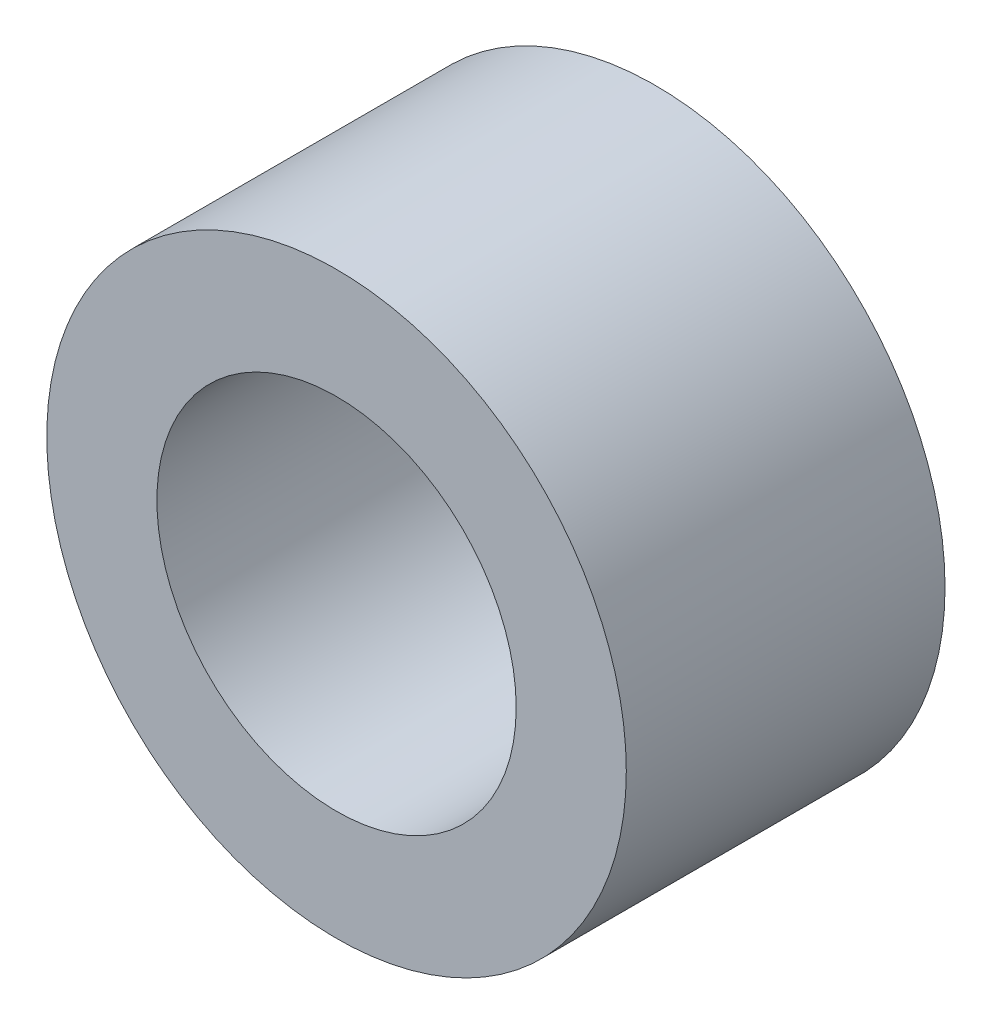
ISO-10303-21;
HEADER;
FILE_DESCRIPTION(('STEP AP214'),'2;1');
FILE_NAME('part.step','',(''),(''),'','','');
FILE_SCHEMA(('AUTOMOTIVE_DESIGN { 1 0 10303 214 1 1 1 1 }'));
ENDSEC;
DATA;
#1=APPLICATION_CONTEXT('core data for automotive mechanical design processes');
#2=APPLICATION_PROTOCOL_DEFINITION('international standard','automotive_design',2000,#1);
#3=PRODUCT_CONTEXT('',#1,'mechanical');
#4=PRODUCT('Part','Part','',(#3));
#5=PRODUCT_RELATED_PRODUCT_CATEGORY('part','',(#4));
#6=PRODUCT_DEFINITION_FORMATION('','',#4);
#7=PRODUCT_DEFINITION_CONTEXT('part definition',#1,'design');
#8=PRODUCT_DEFINITION('design','',#6,#7);
#9=PRODUCT_DEFINITION_SHAPE('','',#8);
#10=(LENGTH_UNIT() NAMED_UNIT(*) SI_UNIT(.MILLI.,.METRE.));
#11=(NAMED_UNIT(*) PLANE_ANGLE_UNIT() SI_UNIT($,.RADIAN.));
#12=(NAMED_UNIT(*) SI_UNIT($,.STERADIAN.) SOLID_ANGLE_UNIT());
#13=UNCERTAINTY_MEASURE_WITH_UNIT(LENGTH_MEASURE(1.E-05),#10,'distance_accuracy_value','');
#14=(GEOMETRIC_REPRESENTATION_CONTEXT(3) GLOBAL_UNCERTAINTY_ASSIGNED_CONTEXT((#13)) GLOBAL_UNIT_ASSIGNED_CONTEXT((#10,
#11,#12)) REPRESENTATION_CONTEXT('',''));
#15=CARTESIAN_POINT('',(0.,0.,0.));
#16=DIRECTION('',(0.,0.,1.));
#17=DIRECTION('',(1.,0.,0.));
#18=AXIS2_PLACEMENT_3D('',#15,#16,#17);
#19=CARTESIAN_POINT('',(0.,0.,5.5));
#20=DIRECTION('',(0.,0.,1.));
#21=DIRECTION('',(1.,0.,0.));
#22=AXIS2_PLACEMENT_3D('',#19,#20,#21);
#23=PLANE('',#22);
#24=CARTESIAN_POINT('',(0.,0.,5.5));
#25=DIRECTION('',(0.,0.,1.));
#26=DIRECTION('',(1.,0.,0.));
#27=AXIS2_PLACEMENT_3D('',#24,#25,#26);
#28=CIRCLE('',#27,5.);
#29=CARTESIAN_POINT('',(5.,0.,5.5));
#30=VERTEX_POINT('',#29);
#31=EDGE_CURVE('E10',#30,#30,#28,.T.);
#32=ORIENTED_EDGE('',*,*,#31,.T.);
#33=EDGE_LOOP('',(#32));
#34=FACE_BOUND('',#33,.T.);
#35=CARTESIAN_POINT('',(0.,0.,5.5));
#36=DIRECTION('',(0.,0.,1.));
#37=DIRECTION('',(1.,0.,0.));
#38=AXIS2_PLACEMENT_3D('',#35,#36,#37);
#39=CIRCLE('',#38,3.1);
#40=CARTESIAN_POINT('',(3.1,0.,5.5));
#41=VERTEX_POINT('',#40);
#42=EDGE_CURVE('E50',#41,#41,#39,.T.);
#43=ORIENTED_EDGE('',*,*,#42,.F.);
#44=EDGE_LOOP('',(#43));
#45=FACE_BOUND('',#44,.T.);
#46=ADVANCED_FACE('F37',(#34,#45),#23,.T.);
#47=CARTESIAN_POINT('',(0.,0.,0.));
#48=DIRECTION('',(0.,0.,1.));
#49=DIRECTION('',(1.,0.,0.));
#50=AXIS2_PLACEMENT_3D('',#47,#48,#49);
#51=PLANE('',#50);
#52=CARTESIAN_POINT('',(0.,0.,0.));
#53=DIRECTION('',(0.,0.,1.));
#54=DIRECTION('',(1.,0.,0.));
#55=AXIS2_PLACEMENT_3D('',#52,#53,#54);
#56=CIRCLE('',#55,5.);
#57=CARTESIAN_POINT('',(5.,0.,0.));
#58=VERTEX_POINT('',#57);
#59=EDGE_CURVE('E41',#58,#58,#56,.T.);
#60=ORIENTED_EDGE('',*,*,#59,.F.);
#61=EDGE_LOOP('',(#60));
#62=FACE_BOUND('',#61,.T.);
#63=CARTESIAN_POINT('',(0.,0.,0.));
#64=DIRECTION('',(0.,0.,1.));
#65=DIRECTION('',(1.,0.,0.));
#66=AXIS2_PLACEMENT_3D('',#63,#64,#65);
#67=CIRCLE('',#66,3.1);
#68=CARTESIAN_POINT('',(3.1,0.,0.));
#69=VERTEX_POINT('',#68);
#70=EDGE_CURVE('E52',#69,#69,#67,.T.);
#71=ORIENTED_EDGE('',*,*,#70,.T.);
#72=EDGE_LOOP('',(#71));
#73=FACE_BOUND('',#72,.T.);
#74=ADVANCED_FACE('F64',(#62,#73),#51,.F.);
#75=CARTESIAN_POINT('',(0.,0.,5.5));
#76=DIRECTION('',(0.,0.,-1.));
#77=DIRECTION('',(-1.,0.,0.));
#78=AXIS2_PLACEMENT_3D('',#75,#76,#77);
#79=CYLINDRICAL_SURFACE('',#78,5.);
#80=ORIENTED_EDGE('',*,*,#31,.F.);
#81=EDGE_LOOP('',(#80));
#82=FACE_BOUND('',#81,.T.);
#83=ORIENTED_EDGE('',*,*,#59,.T.);
#84=EDGE_LOOP('',(#83));
#85=FACE_BOUND('',#84,.T.);
#86=ADVANCED_FACE('F39',(#82,#85),#79,.T.);
#87=CARTESIAN_POINT('',(0.,0.,5.5));
#88=DIRECTION('',(0.,0.,-1.));
#89=DIRECTION('',(-1.,0.,0.));
#90=AXIS2_PLACEMENT_3D('',#87,#88,#89);
#91=CYLINDRICAL_SURFACE('',#90,3.1);
#92=ORIENTED_EDGE('',*,*,#42,.T.);
#93=EDGE_LOOP('',(#92));
#94=FACE_BOUND('',#93,.T.);
#95=ORIENTED_EDGE('',*,*,#70,.F.);
#96=EDGE_LOOP('',(#95));
#97=FACE_BOUND('',#96,.T.);
#98=ADVANCED_FACE('F60',(#94,#97),#91,.F.);
#99=CLOSED_SHELL('',(#46,#74,#86,#98));
#100=MANIFOLD_SOLID_BREP('B2',#99);
#101=ADVANCED_BREP_SHAPE_REPRESENTATION('',(#18,#100),#14);
#102=SHAPE_DEFINITION_REPRESENTATION(#9,#101);
ENDSEC;
END-ISO-10303-21;
